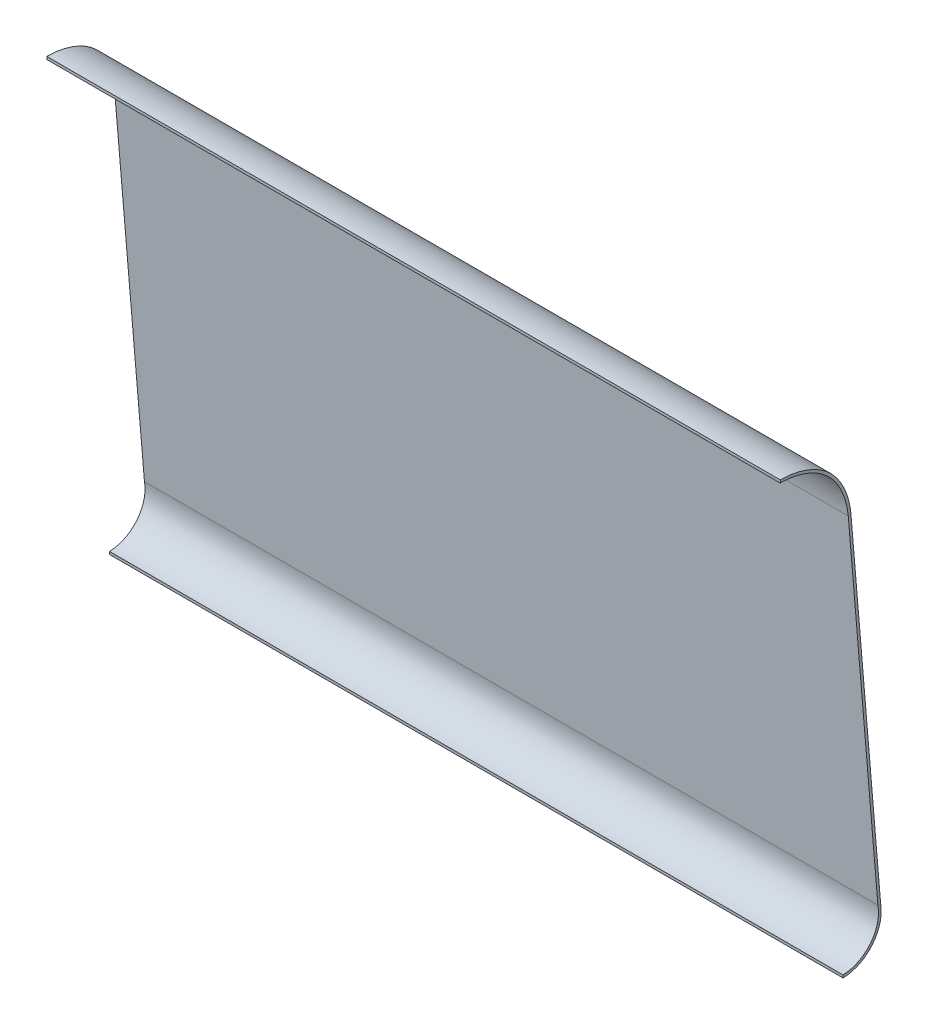
ISO-10303-21;
HEADER;
FILE_DESCRIPTION(('STEP AP214'),'2;1');
FILE_NAME('part.step','',(''),(''),'','','');
FILE_SCHEMA(('AUTOMOTIVE_DESIGN { 1 0 10303 214 1 1 1 1 }'));
ENDSEC;
DATA;
#1=APPLICATION_CONTEXT('core data for automotive mechanical design processes');
#2=APPLICATION_PROTOCOL_DEFINITION('international standard','automotive_design',2000,#1);
#3=PRODUCT_CONTEXT('',#1,'mechanical');
#4=PRODUCT('Part','Part','',(#3));
#5=PRODUCT_RELATED_PRODUCT_CATEGORY('part','',(#4));
#6=PRODUCT_DEFINITION_FORMATION('','',#4);
#7=PRODUCT_DEFINITION_CONTEXT('part definition',#1,'design');
#8=PRODUCT_DEFINITION('design','',#6,#7);
#9=PRODUCT_DEFINITION_SHAPE('','',#8);
#10=(LENGTH_UNIT() NAMED_UNIT(*) SI_UNIT(.MILLI.,.METRE.));
#11=(NAMED_UNIT(*) PLANE_ANGLE_UNIT() SI_UNIT($,.RADIAN.));
#12=(NAMED_UNIT(*) SI_UNIT($,.STERADIAN.) SOLID_ANGLE_UNIT());
#13=UNCERTAINTY_MEASURE_WITH_UNIT(LENGTH_MEASURE(1.E-05),#10,'distance_accuracy_value','');
#14=(GEOMETRIC_REPRESENTATION_CONTEXT(3) GLOBAL_UNCERTAINTY_ASSIGNED_CONTEXT((#13)) GLOBAL_UNIT_ASSIGNED_CONTEXT((#10,
#11,#12)) REPRESENTATION_CONTEXT('',''));
#15=CARTESIAN_POINT('',(0.,0.,0.));
#16=DIRECTION('',(0.,0.,1.));
#17=DIRECTION('',(1.,0.,0.));
#18=AXIS2_PLACEMENT_3D('',#15,#16,#17);
#19=CARTESIAN_POINT('',(-135.,14.6170487804555,28.762438826466));
#20=DIRECTION('',(-1.,0.,0.));
#21=DIRECTION('',(0.,0.,1.));
#22=AXIS2_PLACEMENT_3D('',#19,#20,#21);
#23=PLANE('',#22);
#24=CARTESIAN_POINT('',(-135.,-2.64785334992223,20.6829737067975));
#25=CARTESIAN_POINT('',(-135.,-1.01741304281325,20.8205258550161));
#26=CARTESIAN_POINT('',(-135.,0.577225474017273,21.0988952597736));
#27=CARTESIAN_POINT('',(-135.,2.91694727475834,21.7115021549754));
#28=CARTESIAN_POINT('',(-135.,3.6886125521745,21.9485226239867));
#29=CARTESIAN_POINT('',(-135.,4.83346365539199,22.3540290492571));
#30=CARTESIAN_POINT('',(-135.,5.21297797864175,22.4975506559076));
#31=CARTESIAN_POINT('',(-135.,5.96811956153679,22.8019667596425));
#32=CARTESIAN_POINT('',(-135.,6.34460941817598,22.9632796211003));
#33=CARTESIAN_POINT('',(-135.,8.20158653834091,23.8081366418195));
#34=CARTESIAN_POINT('',(-135.,9.61050832335657,24.6058778019801));
#35=CARTESIAN_POINT('',(-135.,11.5937589825199,26.0046752396325));
#36=CARTESIAN_POINT('',(-135.,12.2331387270018,26.5050525333397));
#37=CARTESIAN_POINT('',(-135.,13.1561429280595,27.3105188252786));
#38=CARTESIAN_POINT('',(-135.,13.4576683967355,27.588037963161));
#39=CARTESIAN_POINT('',(-135.,14.0486095140813,28.1625680769114));
#40=CARTESIAN_POINT('',(-135.,14.3379689771793,28.4596914821407));
#41=CARTESIAN_POINT('',(-135.,15.7333679935604,29.9734282037664));
#42=CARTESIAN_POINT('',(-135.,16.6984015236777,31.2863954709397));
#43=CARTESIAN_POINT('',(-135.,17.938150417145,33.3869019929932));
#44=CARTESIAN_POINT('',(-135.,18.3168926831288,34.1089902256518));
#45=CARTESIAN_POINT('',(-135.,19.0084556478209,35.5951525933706));
#46=CARTESIAN_POINT('',(-135.,19.3186842912649,36.354202665949));
#47=CARTESIAN_POINT('',(-135.,20.1408319650338,38.6480908507744));
#48=CARTESIAN_POINT('',(-135.,20.5531012330365,40.2149779140052));
#49=CARTESIAN_POINT('',(-135.,20.9742163413361,42.622215930353));
#50=CARTESIAN_POINT('',(-135.,21.0810209483219,43.4348576980428));
#51=CARTESIAN_POINT('',(-135.,21.2234591148492,45.0611382106988));
#52=CARTESIAN_POINT('',(-135.,21.2595581156504,45.8771989921807));
#53=CARTESIAN_POINT('',(-135.,21.2595581156503,46.6959086572629));
#54=(BOUNDED_CURVE() B_SPLINE_CURVE(3,(#24,#25,#26,#27,#28,#29,#30,#31,#32,#33,#34,#35,#36,#37,
#38,#39,#40,#41,#42,#43,#44,#45,#46,#47,#48,#49,#50,#51,#52,#53),.UNSPECIFIED.,.F.,
.F.) B_SPLINE_CURVE_WITH_KNOTS((4,2,2,2,2,2,2,2,2,2,2,2,2,2,4),(0.,0.125,0.1875,0.21875,0.25,
0.375,0.4375,0.46875,0.5,0.625,0.6875,0.75,0.875,0.9375,1.),
.UNSPECIFIED.) CURVE() GEOMETRIC_REPRESENTATION_ITEM() RATIONAL_B_SPLINE_CURVE((1.,1.,1.,1.,1.,
1.,1.,1.,1.,1.,1.,1.,1.,1.,1.,1.,1.,1.,1.,1.,1.,1.,1.,1.,1.,1.,1.,1.,1.,1.)) REPRESENTATION_ITEM(''));
#55=CARTESIAN_POINT('',(-135.,-2.64785334992223,20.6829737067975));
#56=VERTEX_POINT('',#55);
#57=CARTESIAN_POINT('',(-135.,21.2595581156503,46.6959086572629));
#58=VERTEX_POINT('',#57);
#59=EDGE_CURVE('E232',#56,#58,#54,.T.);
#60=ORIENTED_EDGE('',*,*,#59,.F.);
#61=DIRECTION('',(0.,0.996460155565987,0.0840663926275493));
#62=VECTOR('',#61,1.);
#63=CARTESIAN_POINT('',(-135.,-2.64785334992223,20.6829737067975));
#64=LINE('',#63,#62);
#65=CARTESIAN_POINT('',(-135.,-132.080981526256,9.76334374316558));
#66=VERTEX_POINT('',#65);
#67=EDGE_CURVE('E31',#66,#56,#64,.T.);
#68=ORIENTED_EDGE('',*,*,#67,.F.);
#69=CARTESIAN_POINT('',(-135.,-134.705455037832,23.9108689253037));
#70=DIRECTION('',(1.,0.,0.));
#71=DIRECTION('',(0.,0.,-1.));
#72=AXIS2_PLACEMENT_3D('',#69,#70,#71);
#73=CIRCLE('',#72,14.3888960657931);
#74=CARTESIAN_POINT('',(-135.,-149.090934410632,23.5973195560745));
#75=VERTEX_POINT('',#74);
#76=EDGE_CURVE('E231',#75,#66,#73,.T.);
#77=ORIENTED_EDGE('',*,*,#76,.F.);
#78=DIRECTION('',(0.,0.999762546551344,0.021791064984792));
#79=VECTOR('',#78,1.);
#80=CARTESIAN_POINT('',(-135.,-149.090934410632,23.5973195560745));
#81=LINE('',#80,#79);
#82=CARTESIAN_POINT('',(-135.,-148.091171864081,23.6191106210593));
#83=VERTEX_POINT('',#82);
#84=EDGE_CURVE('E218',#75,#83,#81,.T.);
#85=ORIENTED_EDGE('',*,*,#84,.T.);
#86=CARTESIAN_POINT('',(-135.,-134.705455037832,23.9108689253037));
#87=DIRECTION('',(1.,0.,0.));
#88=DIRECTION('',(0.,0.,-1.));
#89=AXIS2_PLACEMENT_3D('',#86,#87,#88);
#90=CIRCLE('',#89,13.3888960657931);
#91=CARTESIAN_POINT('',(-135.,-132.215434731416,10.7555530136942));
#92=VERTEX_POINT('',#91);
#93=EDGE_CURVE('E223',#83,#92,#90,.T.);
#94=ORIENTED_EDGE('',*,*,#93,.T.);
#95=DIRECTION('',(0.,0.996460155565987,0.0840663926275493));
#96=VECTOR('',#95,1.);
#97=CARTESIAN_POINT('',(-135.,-2.73191974254978,21.6794338623635));
#98=LINE('',#97,#96);
#99=CARTESIAN_POINT('',(-135.,-2.73191974254978,21.6794338623635));
#100=VERTEX_POINT('',#99);
#101=EDGE_CURVE('E107',#92,#100,#98,.T.);
#102=ORIENTED_EDGE('',*,*,#101,.T.);
#103=CARTESIAN_POINT('',(-135.,20.2595581156503,46.6959086572628));
#104=CARTESIAN_POINT('',(-135.,20.2595581156504,45.9065881080585));
#105=CARTESIAN_POINT('',(-135.,20.2247619660224,45.1197224022541));
#106=CARTESIAN_POINT('',(-135.,20.0873454162241,43.5507759428764));
#107=CARTESIAN_POINT('',(-135.,19.9842629889299,42.7664553767929));
#108=CARTESIAN_POINT('',(-135.,19.5778849530127,40.4434595075199));
#109=CARTESIAN_POINT('',(-135.,19.1799892710392,38.9311356944059));
#110=CARTESIAN_POINT('',(-135.,18.3870594604637,36.7187687658018));
#111=CARTESIAN_POINT('',(-135.,18.088448143027,35.9883310467448));
#112=CARTESIAN_POINT('',(-135.,17.4236094649485,34.559598921964));
#113=CARTESIAN_POINT('',(-135.,16.3325695952718,32.4797912489625));
#114=CARTESIAN_POINT('',(-135.,14.9486943926045,30.5976092176639));
#115=CARTESIAN_POINT('',(-135.,13.6150594080193,29.1508744660178));
#116=CARTESIAN_POINT('',(-135.,13.3383847131535,28.8667816764916));
#117=CARTESIAN_POINT('',(-135.,12.7737313869472,28.3178093166193));
#118=CARTESIAN_POINT('',(-135.,12.485289865573,28.052320722825));
#119=CARTESIAN_POINT('',(-135.,11.6023319810937,27.2818011386943));
#120=CARTESIAN_POINT('',(-135.,10.9902012591776,26.8026884450228));
#121=CARTESIAN_POINT('',(-135.,9.08851832319815,25.4614211645686));
#122=CARTESIAN_POINT('',(-135.,7.7344288091949,24.694228699526));
#123=CARTESIAN_POINT('',(-135.,5.9437508966494,23.8795354058755));
#124=CARTESIAN_POINT('',(-135.,5.58080141336311,23.7240265986622));
#125=CARTESIAN_POINT('',(-135.,4.85252103120287,23.430438904135));
#126=CARTESIAN_POINT('',(-135.,4.48627181967461,23.2919295825419));
#127=CARTESIAN_POINT('',(-135.,3.38137068036588,22.9005734402288));
#128=CARTESIAN_POINT('',(-135.,2.63658896381756,22.6718052824003));
#129=CARTESIAN_POINT('',(-135.,0.378069826470963,22.0804595950432));
#130=CARTESIAN_POINT('',(-135.,-1.15964754723568,21.8120786559857));
#131=CARTESIAN_POINT('',(-135.,-2.73191974250526,21.6794338623661));
#132=(BOUNDED_CURVE() B_SPLINE_CURVE(3,(#103,#104,#105,#106,#107,#108,#109,#110,#111,#112,#113,
#114,#115,#116,#117,#118,#119,#120,#121,#122,#123,#124,#125,#126,#127,#128,#129,#130,#131),
.UNSPECIFIED.,.F.,.F.) B_SPLINE_CURVE_WITH_KNOTS((4,2,2,2,2,1,2,2,2,2,2,2,2,2,4),(0.,0.0625,
0.125,0.25,0.3125,0.375,0.5,0.53125,0.5625,0.625,0.75,0.78125,0.8125,0.875,1.),
.UNSPECIFIED.) CURVE() GEOMETRIC_REPRESENTATION_ITEM() RATIONAL_B_SPLINE_CURVE((1.,1.,1.,1.,1.,
1.,1.,1.,1.,1.,1.,1.,1.,1.,1.,1.,1.,1.,1.,1.,1.,1.,1.,1.,1.,1.,1.,1.,1.)) REPRESENTATION_ITEM(''));
#133=CARTESIAN_POINT('',(-135.,20.2595581156503,46.6959086572628));
#134=VERTEX_POINT('',#133);
#135=EDGE_CURVE('E138',#100,#134,#132,.F.);
#136=ORIENTED_EDGE('',*,*,#135,.T.);
#137=DIRECTION('',(0.,1.,1.45716771982052E-13));
#138=VECTOR('',#137,1.);
#139=CARTESIAN_POINT('',(-135.,20.2595581156503,46.6959086572628));
#140=LINE('',#139,#138);
#141=EDGE_CURVE('E92',#134,#58,#140,.T.);
#142=ORIENTED_EDGE('',*,*,#141,.T.);
#143=EDGE_LOOP('',(#60,#68,#77,#85,#94,#102,#136,#142));
#144=FACE_BOUND('',#143,.T.);
#145=ADVANCED_FACE('F17',(#144),#23,.T.);
#146=CARTESIAN_POINT('',(135.,14.6170487804555,28.762438826466));
#147=DIRECTION('',(-1.,0.,0.));
#148=DIRECTION('',(0.,0.,1.));
#149=AXIS2_PLACEMENT_3D('',#146,#147,#148);
#150=PLANE('',#149);
#151=CARTESIAN_POINT('',(135.,21.2595581156503,46.6959086572629));
#152=CARTESIAN_POINT('',(135.,21.2595581156504,45.8771989921807));
#153=CARTESIAN_POINT('',(135.,21.2234591148492,45.0611382106988));
#154=CARTESIAN_POINT('',(135.,21.0810209483219,43.4348576980428));
#155=CARTESIAN_POINT('',(135.,20.9742163413361,42.622215930353));
#156=CARTESIAN_POINT('',(135.,20.5531012330365,40.2149779140052));
#157=CARTESIAN_POINT('',(135.,20.1408319650338,38.6480908507744));
#158=CARTESIAN_POINT('',(135.,19.3186842912649,36.354202665949));
#159=CARTESIAN_POINT('',(135.,19.0084556478209,35.5951525933706));
#160=CARTESIAN_POINT('',(135.,18.3168926831288,34.1089902256518));
#161=CARTESIAN_POINT('',(135.,17.938150417145,33.3869019929932));
#162=CARTESIAN_POINT('',(135.,16.6984015236777,31.2863954709397));
#163=CARTESIAN_POINT('',(135.,15.7333679935604,29.9734282037664));
#164=CARTESIAN_POINT('',(135.,14.3379689771793,28.4596914821407));
#165=CARTESIAN_POINT('',(135.,14.0486095140813,28.1625680769114));
#166=CARTESIAN_POINT('',(135.,13.4576683967355,27.588037963161));
#167=CARTESIAN_POINT('',(135.,13.1561429280595,27.3105188252786));
#168=CARTESIAN_POINT('',(135.,12.2331387270018,26.5050525333397));
#169=CARTESIAN_POINT('',(135.,11.5937589825199,26.0046752396325));
#170=CARTESIAN_POINT('',(135.,9.61050832335657,24.6058778019801));
#171=CARTESIAN_POINT('',(135.,8.20158653834091,23.8081366418195));
#172=CARTESIAN_POINT('',(135.,6.34460941817598,22.9632796211003));
#173=CARTESIAN_POINT('',(135.,5.96811956153679,22.8019667596425));
#174=CARTESIAN_POINT('',(135.,5.21297797864175,22.4975506559076));
#175=CARTESIAN_POINT('',(135.,4.83346365539199,22.3540290492571));
#176=CARTESIAN_POINT('',(135.,3.6886125521745,21.9485226239867));
#177=CARTESIAN_POINT('',(135.,2.91694727475834,21.7115021549754));
#178=CARTESIAN_POINT('',(135.,0.577225474017273,21.0988952597736));
#179=CARTESIAN_POINT('',(135.,-1.01741304281325,20.8205258550161));
#180=CARTESIAN_POINT('',(135.,-2.64785334987756,20.6829737068002));
#181=(BOUNDED_CURVE() B_SPLINE_CURVE(3,(#151,#152,#153,#154,#155,#156,#157,#158,#159,#160,#161,
#162,#163,#164,#165,#166,#167,#168,#169,#170,#171,#172,#173,#174,#175,#176,#177,#178,#179,#180),
.UNSPECIFIED.,.F.,.F.) B_SPLINE_CURVE_WITH_KNOTS((4,2,2,2,2,2,2,2,2,2,2,2,2,2,4),(0.,0.0625,
0.125,0.25,0.3125,0.375,0.5,0.53125,0.5625,0.625,0.75,0.78125,0.8125,0.875,1.),
.UNSPECIFIED.) CURVE() GEOMETRIC_REPRESENTATION_ITEM() RATIONAL_B_SPLINE_CURVE((1.,1.,1.,1.,1.,
1.,1.,1.,1.,1.,1.,1.,1.,1.,1.,1.,1.,1.,1.,1.,1.,1.,1.,1.,1.,1.,1.,1.,1.,1.)) REPRESENTATION_ITEM(''));
#182=CARTESIAN_POINT('',(135.,-2.64785334992223,20.6829737067975));
#183=VERTEX_POINT('',#182);
#184=CARTESIAN_POINT('',(135.,21.2595581156503,46.6959086572629));
#185=VERTEX_POINT('',#184);
#186=EDGE_CURVE('E133',#183,#185,#181,.F.);
#187=ORIENTED_EDGE('',*,*,#186,.T.);
#188=DIRECTION('',(0.,1.,1.45716771982052E-13));
#189=VECTOR('',#188,1.);
#190=CARTESIAN_POINT('',(135.,20.2595581156503,46.6959086572628));
#191=LINE('',#190,#189);
#192=CARTESIAN_POINT('',(135.,20.2595581156503,46.6959086572628));
#193=VERTEX_POINT('',#192);
#194=EDGE_CURVE('E130',#193,#185,#191,.T.);
#195=ORIENTED_EDGE('',*,*,#194,.F.);
#196=CARTESIAN_POINT('',(135.,-2.73191974254978,21.6794338623635));
#197=CARTESIAN_POINT('',(135.,-1.15964754723568,21.8120786559857));
#198=CARTESIAN_POINT('',(135.,0.378069826470963,22.0804595950432));
#199=CARTESIAN_POINT('',(135.,2.63658896381756,22.6718052824003));
#200=CARTESIAN_POINT('',(135.,3.38137068036588,22.9005734402288));
#201=CARTESIAN_POINT('',(135.,4.48627181967461,23.2919295825419));
#202=CARTESIAN_POINT('',(135.,4.85252103120287,23.430438904135));
#203=CARTESIAN_POINT('',(135.,5.58080141336311,23.7240265986622));
#204=CARTESIAN_POINT('',(135.,5.9437508966494,23.8795354058755));
#205=CARTESIAN_POINT('',(135.,7.7344288091949,24.694228699526));
#206=CARTESIAN_POINT('',(135.,9.08851832319815,25.4614211645686));
#207=CARTESIAN_POINT('',(135.,10.9902012591776,26.8026884450228));
#208=CARTESIAN_POINT('',(135.,11.6023319810937,27.2818011386943));
#209=CARTESIAN_POINT('',(135.,12.485289865573,28.052320722825));
#210=CARTESIAN_POINT('',(135.,12.7737313869472,28.3178093166193));
#211=CARTESIAN_POINT('',(135.,13.3383847131535,28.8667816764916));
#212=CARTESIAN_POINT('',(135.,13.6150594080193,29.1508744660178));
#213=CARTESIAN_POINT('',(135.,14.9486943926045,30.5976092176639));
#214=CARTESIAN_POINT('',(135.,16.3325695952718,32.4797912489625));
#215=CARTESIAN_POINT('',(135.,17.4236094649485,34.559598921964));
#216=CARTESIAN_POINT('',(135.,18.088448143027,35.9883310467448));
#217=CARTESIAN_POINT('',(135.,18.3870594604637,36.7187687658018));
#218=CARTESIAN_POINT('',(135.,19.1799892710392,38.9311356944059));
#219=CARTESIAN_POINT('',(135.,19.5778849530127,40.4434595075199));
#220=CARTESIAN_POINT('',(135.,19.9842629889299,42.7664553767929));
#221=CARTESIAN_POINT('',(135.,20.0873454162241,43.5507759428764));
#222=CARTESIAN_POINT('',(135.,20.2247619660224,45.1197224022541));
#223=CARTESIAN_POINT('',(135.,20.2595581156504,45.9065881080585));
#224=CARTESIAN_POINT('',(135.,20.2595581156503,46.6959086572628));
#225=(BOUNDED_CURVE() B_SPLINE_CURVE(3,(#196,#197,#198,#199,#200,#201,#202,#203,#204,#205,#206,
#207,#208,#209,#210,#211,#212,#213,#214,#215,#216,#217,#218,#219,#220,#221,#222,#223,#224),
.UNSPECIFIED.,.F.,.F.) B_SPLINE_CURVE_WITH_KNOTS((4,2,2,2,2,2,2,2,2,1,2,2,2,2,4),(0.,0.125,
0.1875,0.21875,0.25,0.375,0.4375,0.46875,0.5,0.625,0.6875,0.75,0.875,0.9375,1.),
.UNSPECIFIED.) CURVE() GEOMETRIC_REPRESENTATION_ITEM() RATIONAL_B_SPLINE_CURVE((1.,1.,1.,1.,1.,
1.,1.,1.,1.,1.,1.,1.,1.,1.,1.,1.,1.,1.,1.,1.,1.,1.,1.,1.,1.,1.,1.,1.,1.)) REPRESENTATION_ITEM(''));
#226=CARTESIAN_POINT('',(135.,-2.73191974254978,21.6794338623635));
#227=VERTEX_POINT('',#226);
#228=EDGE_CURVE('E118',#227,#193,#225,.T.);
#229=ORIENTED_EDGE('',*,*,#228,.F.);
#230=DIRECTION('',(0.,0.996460155565987,0.0840663926275493));
#231=VECTOR('',#230,1.);
#232=CARTESIAN_POINT('',(135.,-2.73191974254978,21.6794338623635));
#233=LINE('',#232,#231);
#234=CARTESIAN_POINT('',(135.,-132.215434731416,10.7555530136942));
#235=VERTEX_POINT('',#234);
#236=EDGE_CURVE('E220',#235,#227,#233,.T.);
#237=ORIENTED_EDGE('',*,*,#236,.F.);
#238=CARTESIAN_POINT('',(135.,-134.705455037832,23.9108689253037));
#239=DIRECTION('',(1.,0.,0.));
#240=DIRECTION('',(0.,0.,-1.));
#241=AXIS2_PLACEMENT_3D('',#238,#239,#240);
#242=CIRCLE('',#241,13.3888960657931);
#243=CARTESIAN_POINT('',(135.,-148.091171864081,23.6191106210593));
#244=VERTEX_POINT('',#243);
#245=EDGE_CURVE('E207',#244,#235,#242,.T.);
#246=ORIENTED_EDGE('',*,*,#245,.F.);
#247=DIRECTION('',(0.,0.999762546551344,0.021791064984792));
#248=VECTOR('',#247,1.);
#249=CARTESIAN_POINT('',(135.,-149.090934410632,23.5973195560745));
#250=LINE('',#249,#248);
#251=CARTESIAN_POINT('',(135.,-149.090934410632,23.5973195560745));
#252=VERTEX_POINT('',#251);
#253=EDGE_CURVE('E227',#252,#244,#250,.T.);
#254=ORIENTED_EDGE('',*,*,#253,.F.);
#255=CARTESIAN_POINT('',(135.,-134.705455037832,23.9108689253037));
#256=DIRECTION('',(1.,0.,0.));
#257=DIRECTION('',(0.,0.,-1.));
#258=AXIS2_PLACEMENT_3D('',#255,#256,#257);
#259=CIRCLE('',#258,14.3888960657931);
#260=CARTESIAN_POINT('',(135.,-132.080981526256,9.76334374316558));
#261=VERTEX_POINT('',#260);
#262=EDGE_CURVE('E253',#252,#261,#259,.T.);
#263=ORIENTED_EDGE('',*,*,#262,.T.);
#264=DIRECTION('',(0.,0.996460155565987,0.0840663926275493));
#265=VECTOR('',#264,1.);
#266=CARTESIAN_POINT('',(135.,-2.64785334992223,20.6829737067975));
#267=LINE('',#266,#265);
#268=EDGE_CURVE('E11',#261,#183,#267,.T.);
#269=ORIENTED_EDGE('',*,*,#268,.T.);
#270=EDGE_LOOP('',(#187,#195,#229,#237,#246,#254,#263,#269));
#271=FACE_BOUND('',#270,.T.);
#272=ADVANCED_FACE('F131',(#271),#150,.F.);
#273=CARTESIAN_POINT('',(135.,-2.64785334992223,20.6829737067975));
#274=DIRECTION('',(0.,-0.0840663926275493,0.996460155565987));
#275=DIRECTION('',(-1.,0.,0.));
#276=AXIS2_PLACEMENT_3D('',#273,#274,#275);
#277=PLANE('',#276);
#278=ORIENTED_EDGE('',*,*,#67,.T.);
#279=DIRECTION('',(-1.,0.,0.));
#280=VECTOR('',#279,1.);
#281=CARTESIAN_POINT('',(135.,-2.64785334992223,20.6829737067975));
#282=LINE('',#281,#280);
#283=EDGE_CURVE('E146',#183,#56,#282,.T.);
#284=ORIENTED_EDGE('',*,*,#283,.F.);
#285=ORIENTED_EDGE('',*,*,#268,.F.);
#286=DIRECTION('',(-1.,0.,0.));
#287=VECTOR('',#286,1.);
#288=CARTESIAN_POINT('',(135.,-132.080981526256,9.76334374316558));
#289=LINE('',#288,#287);
#290=EDGE_CURVE('E256',#261,#66,#289,.T.);
#291=ORIENTED_EDGE('',*,*,#290,.T.);
#292=EDGE_LOOP('',(#278,#284,#285,#291));
#293=FACE_BOUND('',#292,.T.);
#294=ADVANCED_FACE('F168',(#293),#277,.F.);
#295=CARTESIAN_POINT('',(135.,-134.705455037832,23.9108689253037));
#296=DIRECTION('',(-1.,0.,0.));
#297=DIRECTION('',(0.,0.,1.));
#298=AXIS2_PLACEMENT_3D('',#295,#296,#297);
#299=CYLINDRICAL_SURFACE('',#298,14.3888960657931);
#300=ORIENTED_EDGE('',*,*,#76,.T.);
#301=ORIENTED_EDGE('',*,*,#290,.F.);
#302=ORIENTED_EDGE('',*,*,#262,.F.);
#303=DIRECTION('',(-1.,0.,0.));
#304=VECTOR('',#303,1.);
#305=CARTESIAN_POINT('',(135.,-149.090934410632,23.5973195560745));
#306=LINE('',#305,#304);
#307=EDGE_CURVE('E226',#252,#75,#306,.T.);
#308=ORIENTED_EDGE('',*,*,#307,.T.);
#309=EDGE_LOOP('',(#300,#301,#302,#308));
#310=FACE_BOUND('',#309,.T.);
#311=ADVANCED_FACE('F171',(#310),#299,.T.);
#312=CARTESIAN_POINT('',(135.,-149.090934410632,23.5973195560745));
#313=DIRECTION('',(0.,-0.021791064984792,0.999762546551344));
#314=DIRECTION('',(-1.,0.,0.));
#315=AXIS2_PLACEMENT_3D('',#312,#313,#314);
#316=PLANE('',#315);
#317=ORIENTED_EDGE('',*,*,#84,.F.);
#318=ORIENTED_EDGE('',*,*,#307,.F.);
#319=ORIENTED_EDGE('',*,*,#253,.T.);
#320=DIRECTION('',(-1.,0.,0.));
#321=VECTOR('',#320,1.);
#322=CARTESIAN_POINT('',(135.,-148.091171864081,23.6191106210593));
#323=LINE('',#322,#321);
#324=EDGE_CURVE('E219',#244,#83,#323,.T.);
#325=ORIENTED_EDGE('',*,*,#324,.T.);
#326=EDGE_LOOP('',(#317,#318,#319,#325));
#327=FACE_BOUND('',#326,.T.);
#328=ADVANCED_FACE('F339',(#327),#316,.T.);
#329=CARTESIAN_POINT('',(135.,-134.705455037832,23.9108689253037));
#330=DIRECTION('',(-1.,0.,0.));
#331=DIRECTION('',(0.,0.,1.));
#332=AXIS2_PLACEMENT_3D('',#329,#330,#331);
#333=CYLINDRICAL_SURFACE('',#332,13.3888960657931);
#334=ORIENTED_EDGE('',*,*,#93,.F.);
#335=ORIENTED_EDGE('',*,*,#324,.F.);
#336=ORIENTED_EDGE('',*,*,#245,.T.);
#337=DIRECTION('',(-1.,0.,0.));
#338=VECTOR('',#337,1.);
#339=CARTESIAN_POINT('',(135.,-132.215434731416,10.7555530136942));
#340=LINE('',#339,#338);
#341=EDGE_CURVE('E198',#235,#92,#340,.T.);
#342=ORIENTED_EDGE('',*,*,#341,.T.);
#343=EDGE_LOOP('',(#334,#335,#336,#342));
#344=FACE_BOUND('',#343,.T.);
#345=ADVANCED_FACE('F334',(#344),#333,.F.);
#346=CARTESIAN_POINT('',(135.,-2.73191974254978,21.6794338623635));
#347=DIRECTION('',(0.,-0.0840663926275493,0.996460155565987));
#348=DIRECTION('',(-1.,0.,0.));
#349=AXIS2_PLACEMENT_3D('',#346,#347,#348);
#350=PLANE('',#349);
#351=ORIENTED_EDGE('',*,*,#101,.F.);
#352=ORIENTED_EDGE('',*,*,#341,.F.);
#353=ORIENTED_EDGE('',*,*,#236,.T.);
#354=DIRECTION('',(-1.,0.,0.));
#355=VECTOR('',#354,1.);
#356=CARTESIAN_POINT('',(135.,-2.73191974254978,21.6794338623635));
#357=LINE('',#356,#355);
#358=EDGE_CURVE('E124',#227,#100,#357,.T.);
#359=ORIENTED_EDGE('',*,*,#358,.T.);
#360=EDGE_LOOP('',(#351,#352,#353,#359));
#361=FACE_BOUND('',#360,.T.);
#362=ADVANCED_FACE('F177',(#361),#350,.T.);
#363=CARTESIAN_POINT('',(135.,-2.73191974250526,21.6794338623661));
#364=CARTESIAN_POINT('',(-135.,-2.73191974250526,21.6794338623661));
#365=CARTESIAN_POINT('',(135.,-1.15964754723568,21.8120786559857));
#366=CARTESIAN_POINT('',(-135.,-1.15964754723568,21.8120786559857));
#367=CARTESIAN_POINT('',(135.,0.378069826470963,22.0804595950432));
#368=CARTESIAN_POINT('',(-135.,0.378069826470963,22.0804595950432));
#369=CARTESIAN_POINT('',(135.,2.63658896381756,22.6718052824003));
#370=CARTESIAN_POINT('',(-135.,2.63658896381756,22.6718052824003));
#371=CARTESIAN_POINT('',(135.,3.38137068036588,22.9005734402288));
#372=CARTESIAN_POINT('',(-135.,3.38137068036588,22.9005734402288));
#373=CARTESIAN_POINT('',(135.,4.48627181967461,23.2919295825419));
#374=CARTESIAN_POINT('',(-135.,4.48627181967461,23.2919295825419));
#375=CARTESIAN_POINT('',(135.,4.85252103120287,23.430438904135));
#376=CARTESIAN_POINT('',(-135.,4.85252103120287,23.430438904135));
#377=CARTESIAN_POINT('',(135.,5.58080141336311,23.7240265986622));
#378=CARTESIAN_POINT('',(-135.,5.58080141336311,23.7240265986622));
#379=CARTESIAN_POINT('',(135.,5.9437508966494,23.8795354058755));
#380=CARTESIAN_POINT('',(-135.,5.9437508966494,23.8795354058755));
#381=CARTESIAN_POINT('',(135.,7.7344288091949,24.694228699526));
#382=CARTESIAN_POINT('',(-135.,7.7344288091949,24.694228699526));
#383=CARTESIAN_POINT('',(135.,9.08851832319815,25.4614211645686));
#384=CARTESIAN_POINT('',(-135.,9.08851832319815,25.4614211645686));
#385=CARTESIAN_POINT('',(135.,10.9902012591776,26.8026884450228));
#386=CARTESIAN_POINT('',(-135.,10.9902012591776,26.8026884450228));
#387=CARTESIAN_POINT('',(135.,11.6023319810937,27.2818011386943));
#388=CARTESIAN_POINT('',(-135.,11.6023319810937,27.2818011386943));
#389=CARTESIAN_POINT('',(135.,12.485289865573,28.052320722825));
#390=CARTESIAN_POINT('',(-135.,12.485289865573,28.052320722825));
#391=CARTESIAN_POINT('',(135.,12.7737313869472,28.3178093166193));
#392=CARTESIAN_POINT('',(-135.,12.7737313869472,28.3178093166193));
#393=CARTESIAN_POINT('',(135.,13.3383847131535,28.8667816764916));
#394=CARTESIAN_POINT('',(-135.,13.3383847131535,28.8667816764916));
#395=CARTESIAN_POINT('',(135.,13.6150594080193,29.1508744660178));
#396=CARTESIAN_POINT('',(-135.,13.6150594080193,29.1508744660178));
#397=CARTESIAN_POINT('',(135.,14.9486943926045,30.5976092176639));
#398=CARTESIAN_POINT('',(-135.,14.9486943926045,30.5976092176639));
#399=CARTESIAN_POINT('',(135.,16.3325695952718,32.4797912489625));
#400=CARTESIAN_POINT('',(-135.,16.3325695952718,32.4797912489625));
#401=CARTESIAN_POINT('',(135.,17.4236094649485,34.559598921964));
#402=CARTESIAN_POINT('',(-135.,17.4236094649485,34.559598921964));
#403=CARTESIAN_POINT('',(135.,18.088448143027,35.9883310467448));
#404=CARTESIAN_POINT('',(-135.,18.088448143027,35.9883310467448));
#405=CARTESIAN_POINT('',(135.,18.3870594604637,36.7187687658018));
#406=CARTESIAN_POINT('',(-135.,18.3870594604637,36.7187687658018));
#407=CARTESIAN_POINT('',(135.,19.1799892710392,38.9311356944059));
#408=CARTESIAN_POINT('',(-135.,19.1799892710392,38.9311356944059));
#409=CARTESIAN_POINT('',(135.,19.5778849530127,40.4434595075199));
#410=CARTESIAN_POINT('',(-135.,19.5778849530127,40.4434595075199));
#411=CARTESIAN_POINT('',(135.,19.9842629889299,42.7664553767929));
#412=CARTESIAN_POINT('',(-135.,19.9842629889299,42.7664553767929));
#413=CARTESIAN_POINT('',(135.,20.0873454162241,43.5507759428764));
#414=CARTESIAN_POINT('',(-135.,20.0873454162241,43.5507759428764));
#415=CARTESIAN_POINT('',(135.,20.2247619660224,45.1197224022541));
#416=CARTESIAN_POINT('',(-135.,20.2247619660224,45.1197224022541));
#417=CARTESIAN_POINT('',(135.,20.2595581156504,45.9065881080585));
#418=CARTESIAN_POINT('',(-135.,20.2595581156504,45.9065881080585));
#419=CARTESIAN_POINT('',(135.,20.2595581156503,46.6959086572628));
#420=CARTESIAN_POINT('',(-135.,20.2595581156503,46.6959086572628));
#421=(BOUNDED_SURFACE() B_SPLINE_SURFACE(3,1,((#363,#364),(#365,#366),(#367,#368),(#369,#370),
(#371,#372),(#373,#374),(#375,#376),(#377,#378),(#379,#380),(#381,#382),(#383,#384),(#385,#386),
(#387,#388),(#389,#390),(#391,#392),(#393,#394),(#395,#396),(#397,#398),(#399,#400),(#401,#402),
(#403,#404),(#405,#406),(#407,#408),(#409,#410),(#411,#412),(#413,#414),(#415,#416),(#417,#418),
(#419,#420)),.UNSPECIFIED.,.F.,.F.,.F.) B_SPLINE_SURFACE_WITH_KNOTS((4,2,2,2,2,2,2,2,2,1,2,2,2,
2,4),(2,2),(0.,0.125,0.1875,0.21875,0.25,0.375,0.4375,0.46875,0.5,0.625,0.6875,0.75,0.875,
0.9375,1.),(0.,1.),
.UNSPECIFIED.) GEOMETRIC_REPRESENTATION_ITEM() RATIONAL_B_SPLINE_SURFACE(((1.,1.),(1.,1.),(1.,
1.),(1.,1.),(1.,1.),(1.,1.),(1.,1.),(1.,1.),(1.,1.),(1.,1.),(1.,1.),(1.,1.),(1.,1.),(1.,1.),(1.,
1.),(1.,1.),(1.,1.),(1.,1.),(1.,1.),(1.,1.),(1.,1.),(1.,1.),(1.,1.),(1.,1.),(1.,1.),(1.,1.),(1.,
1.),(1.,1.),(1.,1.))) REPRESENTATION_ITEM('') SURFACE());
#422=DIRECTION('',(-1.,0.,0.));
#423=VECTOR('',#422,1.);
#424=CARTESIAN_POINT('',(135.,20.2595581156503,46.6959086572628));
#425=LINE('',#424,#423);
#426=EDGE_CURVE('E123',#193,#134,#425,.T.);
#427=ORIENTED_EDGE('',*,*,#135,.F.);
#428=ORIENTED_EDGE('',*,*,#358,.F.);
#429=ORIENTED_EDGE('',*,*,#228,.T.);
#430=ORIENTED_EDGE('',*,*,#426,.T.);
#431=EDGE_LOOP('',(#427,#428,#429,#430));
#432=FACE_BOUND('',#431,.T.);
#433=ADVANCED_FACE('F121',(#432),#421,.T.);
#434=CARTESIAN_POINT('',(135.,20.2595581156503,46.6959086572628));
#435=DIRECTION('',(0.,-1.45716771982052E-13,1.));
#436=DIRECTION('',(0.,-1.,-1.45716771982052E-13));
#437=AXIS2_PLACEMENT_3D('',#434,#435,#436);
#438=PLANE('',#437);
#439=ORIENTED_EDGE('',*,*,#141,.F.);
#440=ORIENTED_EDGE('',*,*,#426,.F.);
#441=ORIENTED_EDGE('',*,*,#194,.T.);
#442=DIRECTION('',(-1.,0.,0.));
#443=VECTOR('',#442,1.);
#444=CARTESIAN_POINT('',(135.,21.2595581156503,46.6959086572629));
#445=LINE('',#444,#443);
#446=EDGE_CURVE('E237',#185,#58,#445,.T.);
#447=ORIENTED_EDGE('',*,*,#446,.T.);
#448=EDGE_LOOP('',(#439,#440,#441,#447));
#449=FACE_BOUND('',#448,.T.);
#450=ADVANCED_FACE('F140',(#449),#438,.T.);
#451=CARTESIAN_POINT('',(135.,-2.64785334987756,20.6829737068002));
#452=CARTESIAN_POINT('',(-135.,-2.64785334987756,20.6829737068002));
#453=CARTESIAN_POINT('',(135.,-1.01741304281325,20.8205258550161));
#454=CARTESIAN_POINT('',(-135.,-1.01741304281325,20.8205258550161));
#455=CARTESIAN_POINT('',(135.,0.577225474017273,21.0988952597736));
#456=CARTESIAN_POINT('',(-135.,0.577225474017273,21.0988952597736));
#457=CARTESIAN_POINT('',(135.,2.91694727475834,21.7115021549754));
#458=CARTESIAN_POINT('',(-135.,2.91694727475834,21.7115021549754));
#459=CARTESIAN_POINT('',(135.,3.6886125521745,21.9485226239867));
#460=CARTESIAN_POINT('',(-135.,3.6886125521745,21.9485226239867));
#461=CARTESIAN_POINT('',(135.,4.83346365539199,22.3540290492571));
#462=CARTESIAN_POINT('',(-135.,4.83346365539199,22.3540290492571));
#463=CARTESIAN_POINT('',(135.,5.21297797864175,22.4975506559076));
#464=CARTESIAN_POINT('',(-135.,5.21297797864175,22.4975506559076));
#465=CARTESIAN_POINT('',(135.,5.96811956153679,22.8019667596425));
#466=CARTESIAN_POINT('',(-135.,5.96811956153679,22.8019667596425));
#467=CARTESIAN_POINT('',(135.,6.34460941817598,22.9632796211003));
#468=CARTESIAN_POINT('',(-135.,6.34460941817598,22.9632796211003));
#469=CARTESIAN_POINT('',(135.,8.20158653834091,23.8081366418195));
#470=CARTESIAN_POINT('',(-135.,8.20158653834091,23.8081366418195));
#471=CARTESIAN_POINT('',(135.,9.61050832335657,24.6058778019801));
#472=CARTESIAN_POINT('',(-135.,9.61050832335657,24.6058778019801));
#473=CARTESIAN_POINT('',(135.,11.5937589825199,26.0046752396325));
#474=CARTESIAN_POINT('',(-135.,11.5937589825199,26.0046752396325));
#475=CARTESIAN_POINT('',(135.,12.2331387270018,26.5050525333397));
#476=CARTESIAN_POINT('',(-135.,12.2331387270018,26.5050525333397));
#477=CARTESIAN_POINT('',(135.,13.1561429280595,27.3105188252786));
#478=CARTESIAN_POINT('',(-135.,13.1561429280595,27.3105188252786));
#479=CARTESIAN_POINT('',(135.,13.4576683967355,27.588037963161));
#480=CARTESIAN_POINT('',(-135.,13.4576683967355,27.588037963161));
#481=CARTESIAN_POINT('',(135.,14.0486095140813,28.1625680769114));
#482=CARTESIAN_POINT('',(-135.,14.0486095140813,28.1625680769114));
#483=CARTESIAN_POINT('',(135.,14.3379689771793,28.4596914821407));
#484=CARTESIAN_POINT('',(-135.,14.3379689771793,28.4596914821407));
#485=CARTESIAN_POINT('',(135.,15.7333679935604,29.9734282037664));
#486=CARTESIAN_POINT('',(-135.,15.7333679935604,29.9734282037664));
#487=CARTESIAN_POINT('',(135.,16.6984015236777,31.2863954709397));
#488=CARTESIAN_POINT('',(-135.,16.6984015236777,31.2863954709397));
#489=CARTESIAN_POINT('',(135.,17.938150417145,33.3869019929932));
#490=CARTESIAN_POINT('',(-135.,17.938150417145,33.3869019929932));
#491=CARTESIAN_POINT('',(135.,18.3168926831288,34.1089902256518));
#492=CARTESIAN_POINT('',(-135.,18.3168926831288,34.1089902256518));
#493=CARTESIAN_POINT('',(135.,19.0084556478209,35.5951525933706));
#494=CARTESIAN_POINT('',(-135.,19.0084556478209,35.5951525933706));
#495=CARTESIAN_POINT('',(135.,19.3186842912649,36.354202665949));
#496=CARTESIAN_POINT('',(-135.,19.3186842912649,36.354202665949));
#497=CARTESIAN_POINT('',(135.,20.1408319650338,38.6480908507744));
#498=CARTESIAN_POINT('',(-135.,20.1408319650338,38.6480908507744));
#499=CARTESIAN_POINT('',(135.,20.5531012330365,40.2149779140052));
#500=CARTESIAN_POINT('',(-135.,20.5531012330365,40.2149779140052));
#501=CARTESIAN_POINT('',(135.,20.9742163413361,42.622215930353));
#502=CARTESIAN_POINT('',(-135.,20.9742163413361,42.622215930353));
#503=CARTESIAN_POINT('',(135.,21.0810209483219,43.4348576980428));
#504=CARTESIAN_POINT('',(-135.,21.0810209483219,43.4348576980428));
#505=CARTESIAN_POINT('',(135.,21.2234591148492,45.0611382106988));
#506=CARTESIAN_POINT('',(-135.,21.2234591148492,45.0611382106988));
#507=CARTESIAN_POINT('',(135.,21.2595581156504,45.8771989921807));
#508=CARTESIAN_POINT('',(-135.,21.2595581156504,45.8771989921807));
#509=CARTESIAN_POINT('',(135.,21.2595581156503,46.6959086572629));
#510=CARTESIAN_POINT('',(-135.,21.2595581156503,46.6959086572629));
#511=(BOUNDED_SURFACE() B_SPLINE_SURFACE(3,1,((#451,#452),(#453,#454),(#455,#456),(#457,#458),
(#459,#460),(#461,#462),(#463,#464),(#465,#466),(#467,#468),(#469,#470),(#471,#472),(#473,#474),
(#475,#476),(#477,#478),(#479,#480),(#481,#482),(#483,#484),(#485,#486),(#487,#488),(#489,#490),
(#491,#492),(#493,#494),(#495,#496),(#497,#498),(#499,#500),(#501,#502),(#503,#504),(#505,#506),
(#507,#508),(#509,#510)),.UNSPECIFIED.,.F.,.F.,.F.) B_SPLINE_SURFACE_WITH_KNOTS((4,2,2,2,2,2,2,
2,2,2,2,2,2,2,4),(2,2),(0.,0.125,0.1875,0.21875,0.25,0.375,0.4375,0.46875,0.5,0.625,0.6875,0.75,
0.875,0.9375,1.),(0.,1.),
.UNSPECIFIED.) GEOMETRIC_REPRESENTATION_ITEM() RATIONAL_B_SPLINE_SURFACE(((1.,1.),(1.,1.),(1.,
1.),(1.,1.),(1.,1.),(1.,1.),(1.,1.),(1.,1.),(1.,1.),(1.,1.),(1.,1.),(1.,1.),(1.,1.),(1.,1.),(1.,
1.),(1.,1.),(1.,1.),(1.,1.),(1.,1.),(1.,1.),(1.,1.),(1.,1.),(1.,1.),(1.,1.),(1.,1.),(1.,1.),(1.,
1.),(1.,1.),(1.,1.),(1.,1.))) REPRESENTATION_ITEM('') SURFACE());
#512=ORIENTED_EDGE('',*,*,#59,.T.);
#513=ORIENTED_EDGE('',*,*,#446,.F.);
#514=ORIENTED_EDGE('',*,*,#186,.F.);
#515=ORIENTED_EDGE('',*,*,#283,.T.);
#516=EDGE_LOOP('',(#512,#513,#514,#515));
#517=FACE_BOUND('',#516,.T.);
#518=ADVANCED_FACE('F19',(#517),#511,.F.);
#519=CLOSED_SHELL('',(#145,#272,#294,#311,#328,#345,#362,#433,#450,#518));
#520=MANIFOLD_SOLID_BREP('B1',#519);
#521=ADVANCED_BREP_SHAPE_REPRESENTATION('',(#18,#520),#14);
#522=SHAPE_DEFINITION_REPRESENTATION(#9,#521);
ENDSEC;
END-ISO-10303-21;
